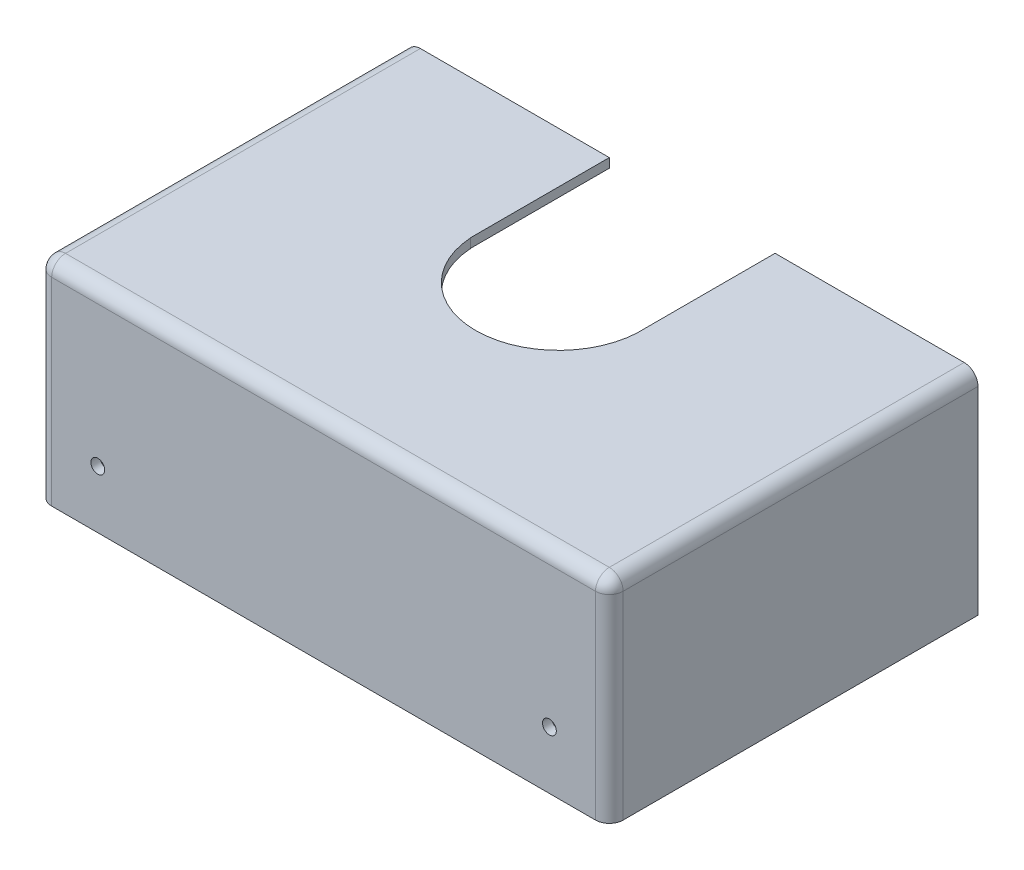
ISO-10303-21;
HEADER;
FILE_DESCRIPTION(('STEP AP214'),'2;1');
FILE_NAME('part.step','',(''),(''),'','','');
FILE_SCHEMA(('AUTOMOTIVE_DESIGN { 1 0 10303 214 1 1 1 1 }'));
ENDSEC;
DATA;
#1=APPLICATION_CONTEXT('core data for automotive mechanical design processes');
#2=APPLICATION_PROTOCOL_DEFINITION('international standard','automotive_design',2000,#1);
#3=PRODUCT_CONTEXT('',#1,'mechanical');
#4=PRODUCT('Part','Part','',(#3));
#5=PRODUCT_RELATED_PRODUCT_CATEGORY('part','',(#4));
#6=PRODUCT_DEFINITION_FORMATION('','',#4);
#7=PRODUCT_DEFINITION_CONTEXT('part definition',#1,'design');
#8=PRODUCT_DEFINITION('design','',#6,#7);
#9=PRODUCT_DEFINITION_SHAPE('','',#8);
#10=(LENGTH_UNIT() NAMED_UNIT(*) SI_UNIT(.MILLI.,.METRE.));
#11=(NAMED_UNIT(*) PLANE_ANGLE_UNIT() SI_UNIT($,.RADIAN.));
#12=(NAMED_UNIT(*) SI_UNIT($,.STERADIAN.) SOLID_ANGLE_UNIT());
#13=UNCERTAINTY_MEASURE_WITH_UNIT(LENGTH_MEASURE(1.E-05),#10,'distance_accuracy_value','');
#14=(GEOMETRIC_REPRESENTATION_CONTEXT(3) GLOBAL_UNCERTAINTY_ASSIGNED_CONTEXT((#13)) GLOBAL_UNIT_ASSIGNED_CONTEXT((#10,
#11,#12)) REPRESENTATION_CONTEXT('',''));
#15=CARTESIAN_POINT('',(0.,0.,0.));
#16=DIRECTION('',(0.,0.,1.));
#17=DIRECTION('',(1.,0.,0.));
#18=AXIS2_PLACEMENT_3D('',#15,#16,#17);
#19=CARTESIAN_POINT('',(0.,0.,0.));
#20=DIRECTION('',(0.,0.,-1.));
#21=DIRECTION('',(-1.,0.,0.));
#22=AXIS2_PLACEMENT_3D('',#19,#20,#21);
#23=PLANE('',#22);
#24=DIRECTION('',(-1.,0.,0.));
#25=VECTOR('',#24,1.);
#26=CARTESIAN_POINT('',(0.,46.,0.));
#27=LINE('',#26,#25);
#28=CARTESIAN_POINT('',(121.,46.,0.));
#29=VERTEX_POINT('',#28);
#30=CARTESIAN_POINT('',(79.964383320974,46.,0.));
#31=VERTEX_POINT('',#30);
#32=EDGE_CURVE('E184',#29,#31,#27,.T.);
#33=ORIENTED_EDGE('',*,*,#32,.F.);
#34=CARTESIAN_POINT('',(121.,43.,0.));
#35=DIRECTION('',(0.,0.,-1.));
#36=DIRECTION('',(-1.,0.,0.));
#37=AXIS2_PLACEMENT_3D('',#34,#35,#36);
#38=CIRCLE('',#37,3.);
#39=CARTESIAN_POINT('',(124.,43.,0.));
#40=VERTEX_POINT('',#39);
#41=EDGE_CURVE('E11',#29,#40,#38,.T.);
#42=ORIENTED_EDGE('',*,*,#41,.T.);
#43=DIRECTION('',(0.,1.,0.));
#44=VECTOR('',#43,1.);
#45=CARTESIAN_POINT('',(124.,0.,0.));
#46=LINE('',#45,#44);
#47=CARTESIAN_POINT('',(124.,0.,0.));
#48=VERTEX_POINT('',#47);
#49=EDGE_CURVE('E251',#48,#40,#46,.T.);
#50=ORIENTED_EDGE('',*,*,#49,.F.);
#51=DIRECTION('',(1.,0.,0.));
#52=VECTOR('',#51,1.);
#53=CARTESIAN_POINT('',(0.,0.,0.));
#54=LINE('',#53,#52);
#55=CARTESIAN_POINT('',(122.,0.,0.));
#56=VERTEX_POINT('',#55);
#57=EDGE_CURVE('E247',#56,#48,#54,.T.);
#58=ORIENTED_EDGE('',*,*,#57,.F.);
#59=DIRECTION('',(0.,-1.,0.));
#60=VECTOR('',#59,1.);
#61=CARTESIAN_POINT('',(122.,0.,0.));
#62=LINE('',#61,#60);
#63=CARTESIAN_POINT('',(122.,43.,0.));
#64=VERTEX_POINT('',#63);
#65=EDGE_CURVE('E232',#64,#56,#62,.T.);
#66=ORIENTED_EDGE('',*,*,#65,.F.);
#67=CARTESIAN_POINT('',(121.,43.,0.));
#68=DIRECTION('',(0.,0.,-1.));
#69=DIRECTION('',(-1.,0.,0.));
#70=AXIS2_PLACEMENT_3D('',#67,#68,#69);
#71=CIRCLE('',#70,1.);
#72=CARTESIAN_POINT('',(121.,44.,0.));
#73=VERTEX_POINT('',#72);
#74=EDGE_CURVE('E303',#64,#73,#71,.F.);
#75=ORIENTED_EDGE('',*,*,#74,.T.);
#76=DIRECTION('',(1.,0.,0.));
#77=VECTOR('',#76,1.);
#78=CARTESIAN_POINT('',(122.,44.,0.));
#79=LINE('',#78,#77);
#80=CARTESIAN_POINT('',(79.964383320974,44.,0.));
#81=VERTEX_POINT('',#80);
#82=EDGE_CURVE('E207',#81,#73,#79,.T.);
#83=ORIENTED_EDGE('',*,*,#82,.F.);
#84=DIRECTION('',(0.,1.,0.));
#85=VECTOR('',#84,1.);
#86=CARTESIAN_POINT('',(79.964383320974,-32.,0.));
#87=LINE('',#86,#85);
#88=EDGE_CURVE('E198',#81,#31,#87,.T.);
#89=ORIENTED_EDGE('',*,*,#88,.T.);
#90=EDGE_LOOP('',(#33,#42,#50,#58,#66,#75,#83,#89));
#91=FACE_BOUND('',#90,.T.);
#92=ADVANCED_FACE('F40',(#91),#23,.T.);
#93=CARTESIAN_POINT('',(0.,0.,80.));
#94=DIRECTION('',(1.,0.,0.));
#95=DIRECTION('',(0.,0.,-1.));
#96=AXIS2_PLACEMENT_3D('',#93,#94,#95);
#97=PLANE('',#96);
#98=DIRECTION('',(0.,0.,-1.));
#99=VECTOR('',#98,1.);
#100=CARTESIAN_POINT('',(0.,0.,80.));
#101=LINE('',#100,#99);
#102=CARTESIAN_POINT('',(0.,0.,77.));
#103=VERTEX_POINT('',#102);
#104=CARTESIAN_POINT('',(0.,0.,0.));
#105=VERTEX_POINT('',#104);
#106=EDGE_CURVE('E254',#103,#105,#101,.T.);
#107=ORIENTED_EDGE('',*,*,#106,.F.);
#108=DIRECTION('',(0.,-1.,0.));
#109=VECTOR('',#108,1.);
#110=CARTESIAN_POINT('',(0.,0.,77.));
#111=LINE('',#110,#109);
#112=CARTESIAN_POINT('',(0.,43.,77.));
#113=VERTEX_POINT('',#112);
#114=EDGE_CURVE('E322',#103,#113,#111,.F.);
#115=ORIENTED_EDGE('',*,*,#114,.T.);
#116=DIRECTION('',(0.,0.,-1.));
#117=VECTOR('',#116,1.);
#118=CARTESIAN_POINT('',(0.,43.,80.));
#119=LINE('',#118,#117);
#120=CARTESIAN_POINT('',(0.,43.,0.));
#121=VERTEX_POINT('',#120);
#122=EDGE_CURVE('E320',#113,#121,#119,.T.);
#123=ORIENTED_EDGE('',*,*,#122,.T.);
#124=DIRECTION('',(0.,-1.,0.));
#125=VECTOR('',#124,1.);
#126=CARTESIAN_POINT('',(0.,0.,0.));
#127=LINE('',#126,#125);
#128=EDGE_CURVE('E241',#121,#105,#127,.T.);
#129=ORIENTED_EDGE('',*,*,#128,.T.);
#130=EDGE_LOOP('',(#107,#115,#123,#129));
#131=FACE_BOUND('',#130,.T.);
#132=ADVANCED_FACE('F387',(#131),#97,.F.);
#133=CARTESIAN_POINT('',(0.,0.,80.));
#134=DIRECTION('',(0.,1.,0.));
#135=DIRECTION('',(0.,0.,1.));
#136=AXIS2_PLACEMENT_3D('',#133,#134,#135);
#137=PLANE('',#136);
#138=DIRECTION('',(1.,0.,0.));
#139=VECTOR('',#138,1.);
#140=CARTESIAN_POINT('',(0.,0.,80.));
#141=LINE('',#140,#139);
#142=CARTESIAN_POINT('',(3.,0.,80.));
#143=VERTEX_POINT('',#142);
#144=CARTESIAN_POINT('',(121.,0.,80.));
#145=VERTEX_POINT('',#144);
#146=EDGE_CURVE('E193',#143,#145,#141,.T.);
#147=ORIENTED_EDGE('',*,*,#146,.F.);
#148=CARTESIAN_POINT('',(3.,0.,77.));
#149=DIRECTION('',(0.,1.,0.));
#150=DIRECTION('',(0.,0.,1.));
#151=AXIS2_PLACEMENT_3D('',#148,#149,#150);
#152=CIRCLE('',#151,3.);
#153=EDGE_CURVE('E318',#143,#103,#152,.F.);
#154=ORIENTED_EDGE('',*,*,#153,.T.);
#155=ORIENTED_EDGE('',*,*,#106,.T.);
#156=CARTESIAN_POINT('',(2.,0.,0.));
#157=VERTEX_POINT('',#156);
#158=EDGE_CURVE('E248',#105,#157,#54,.T.);
#159=ORIENTED_EDGE('',*,*,#158,.T.);
#160=DIRECTION('',(0.,0.,-1.));
#161=VECTOR('',#160,1.);
#162=CARTESIAN_POINT('',(2.,0.,78.));
#163=LINE('',#162,#161);
#164=CARTESIAN_POINT('',(2.,0.,77.));
#165=VERTEX_POINT('',#164);
#166=EDGE_CURVE('E239',#165,#157,#163,.T.);
#167=ORIENTED_EDGE('',*,*,#166,.F.);
#168=CARTESIAN_POINT('',(3.,0.,77.));
#169=DIRECTION('',(0.,1.,0.));
#170=DIRECTION('',(0.,0.,1.));
#171=AXIS2_PLACEMENT_3D('',#168,#169,#170);
#172=CIRCLE('',#171,1.);
#173=CARTESIAN_POINT('',(3.,0.,78.));
#174=VERTEX_POINT('',#173);
#175=EDGE_CURVE('E277',#165,#174,#172,.T.);
#176=ORIENTED_EDGE('',*,*,#175,.T.);
#177=DIRECTION('',(-1.,0.,0.));
#178=VECTOR('',#177,1.);
#179=CARTESIAN_POINT('',(122.,0.,78.));
#180=LINE('',#179,#178);
#181=CARTESIAN_POINT('',(121.,0.,78.));
#182=VERTEX_POINT('',#181);
#183=EDGE_CURVE('E228',#182,#174,#180,.T.);
#184=ORIENTED_EDGE('',*,*,#183,.F.);
#185=CARTESIAN_POINT('',(121.,0.,77.));
#186=DIRECTION('',(0.,1.,0.));
#187=DIRECTION('',(0.,0.,1.));
#188=AXIS2_PLACEMENT_3D('',#185,#186,#187);
#189=CIRCLE('',#188,1.);
#190=CARTESIAN_POINT('',(122.,0.,77.));
#191=VERTEX_POINT('',#190);
#192=EDGE_CURVE('E301',#182,#191,#189,.T.);
#193=ORIENTED_EDGE('',*,*,#192,.T.);
#194=DIRECTION('',(0.,0.,-1.));
#195=VECTOR('',#194,1.);
#196=CARTESIAN_POINT('',(122.,0.,78.));
#197=LINE('',#196,#195);
#198=EDGE_CURVE('E230',#191,#56,#197,.T.);
#199=ORIENTED_EDGE('',*,*,#198,.T.);
#200=ORIENTED_EDGE('',*,*,#57,.T.);
#201=DIRECTION('',(0.,0.,-1.));
#202=VECTOR('',#201,1.);
#203=CARTESIAN_POINT('',(124.,0.,80.));
#204=LINE('',#203,#202);
#205=CARTESIAN_POINT('',(124.,0.,77.));
#206=VERTEX_POINT('',#205);
#207=EDGE_CURVE('E245',#206,#48,#204,.T.);
#208=ORIENTED_EDGE('',*,*,#207,.F.);
#209=CARTESIAN_POINT('',(121.,0.,77.));
#210=DIRECTION('',(0.,1.,0.));
#211=DIRECTION('',(0.,0.,1.));
#212=AXIS2_PLACEMENT_3D('',#209,#210,#211);
#213=CIRCLE('',#212,3.);
#214=EDGE_CURVE('E316',#206,#145,#213,.F.);
#215=ORIENTED_EDGE('',*,*,#214,.T.);
#216=EDGE_LOOP('',(#147,#154,#155,#159,#167,#176,#184,#193,#199,#200,#208,#215));
#217=FACE_BOUND('',#216,.T.);
#218=ADVANCED_FACE('F373',(#217),#137,.F.);
#219=CARTESIAN_POINT('',(124.,0.,80.));
#220=DIRECTION('',(-1.,0.,0.));
#221=DIRECTION('',(0.,0.,1.));
#222=AXIS2_PLACEMENT_3D('',#219,#220,#221);
#223=PLANE('',#222);
#224=DIRECTION('',(0.,0.,-1.));
#225=VECTOR('',#224,1.);
#226=CARTESIAN_POINT('',(124.,43.,80.));
#227=LINE('',#226,#225);
#228=CARTESIAN_POINT('',(124.,43.,77.));
#229=VERTEX_POINT('',#228);
#230=EDGE_CURVE('E57',#40,#229,#227,.F.);
#231=ORIENTED_EDGE('',*,*,#230,.T.);
#232=DIRECTION('',(0.,1.,0.));
#233=VECTOR('',#232,1.);
#234=CARTESIAN_POINT('',(124.,0.,77.));
#235=LINE('',#234,#233);
#236=EDGE_CURVE('E49',#229,#206,#235,.F.);
#237=ORIENTED_EDGE('',*,*,#236,.T.);
#238=ORIENTED_EDGE('',*,*,#207,.T.);
#239=ORIENTED_EDGE('',*,*,#49,.T.);
#240=EDGE_LOOP('',(#231,#237,#238,#239));
#241=FACE_BOUND('',#240,.T.);
#242=ADVANCED_FACE('F370',(#241),#223,.F.);
#243=CARTESIAN_POINT('',(0.,46.,80.));
#244=DIRECTION('',(0.,-1.,0.));
#245=DIRECTION('',(0.,0.,-1.));
#246=AXIS2_PLACEMENT_3D('',#243,#244,#245);
#247=PLANE('',#246);
#248=CARTESIAN_POINT('',(44.,46.,0.));
#249=VERTEX_POINT('',#248);
#250=CARTESIAN_POINT('',(3.,46.,0.));
#251=VERTEX_POINT('',#250);
#252=EDGE_CURVE('E194',#249,#251,#27,.T.);
#253=ORIENTED_EDGE('',*,*,#252,.T.);
#254=DIRECTION('',(0.,0.,-1.));
#255=VECTOR('',#254,1.);
#256=CARTESIAN_POINT('',(3.,46.,80.));
#257=LINE('',#256,#255);
#258=CARTESIAN_POINT('',(3.,46.,77.));
#259=VERTEX_POINT('',#258);
#260=EDGE_CURVE('E329',#251,#259,#257,.F.);
#261=ORIENTED_EDGE('',*,*,#260,.T.);
#262=DIRECTION('',(-1.,0.,0.));
#263=VECTOR('',#262,1.);
#264=CARTESIAN_POINT('',(0.,46.,77.));
#265=LINE('',#264,#263);
#266=CARTESIAN_POINT('',(121.,46.,77.));
#267=VERTEX_POINT('',#266);
#268=EDGE_CURVE('E327',#259,#267,#265,.F.);
#269=ORIENTED_EDGE('',*,*,#268,.T.);
#270=DIRECTION('',(0.,0.,-1.));
#271=VECTOR('',#270,1.);
#272=CARTESIAN_POINT('',(121.,46.,80.));
#273=LINE('',#272,#271);
#274=EDGE_CURVE('E191',#267,#29,#273,.T.);
#275=ORIENTED_EDGE('',*,*,#274,.T.);
#276=ORIENTED_EDGE('',*,*,#32,.T.);
#277=DIRECTION('',(0.,0.,-1.));
#278=VECTOR('',#277,1.);
#279=CARTESIAN_POINT('',(79.964383320974,46.,30.1317826191945));
#280=LINE('',#279,#278);
#281=CARTESIAN_POINT('',(79.964383320974,46.,27.8682173808054));
#282=VERTEX_POINT('',#281);
#283=EDGE_CURVE('E188',#282,#31,#280,.T.);
#284=ORIENTED_EDGE('',*,*,#283,.F.);
#285=CARTESIAN_POINT('',(62.,46.,29.));
#286=DIRECTION('',(0.,1.,0.));
#287=DIRECTION('',(0.,0.,1.));
#288=AXIS2_PLACEMENT_3D('',#285,#286,#287);
#289=CIRCLE('',#288,18.);
#290=CARTESIAN_POINT('',(44.035616679026,46.,30.1317826191945));
#291=VERTEX_POINT('',#290);
#292=EDGE_CURVE('E225',#291,#282,#289,.T.);
#293=ORIENTED_EDGE('',*,*,#292,.F.);
#294=DIRECTION('',(1.,0.,0.));
#295=VECTOR('',#294,1.);
#296=CARTESIAN_POINT('',(79.964383320974,46.,30.1317826191945));
#297=LINE('',#296,#295);
#298=CARTESIAN_POINT('',(44.,46.,30.1317826191945));
#299=VERTEX_POINT('',#298);
#300=EDGE_CURVE('E209',#299,#291,#297,.T.);
#301=ORIENTED_EDGE('',*,*,#300,.F.);
#302=DIRECTION('',(0.,0.,1.));
#303=VECTOR('',#302,1.);
#304=CARTESIAN_POINT('',(44.,46.,30.1317826191945));
#305=LINE('',#304,#303);
#306=EDGE_CURVE('E202',#249,#299,#305,.T.);
#307=ORIENTED_EDGE('',*,*,#306,.F.);
#308=EDGE_LOOP('',(#253,#261,#269,#275,#276,#284,#293,#301,#307));
#309=FACE_BOUND('',#308,.T.);
#310=ADVANCED_FACE('F187',(#309),#247,.F.);
#311=CARTESIAN_POINT('',(0.,0.,80.));
#312=DIRECTION('',(0.,0.,-1.));
#313=DIRECTION('',(-1.,0.,0.));
#314=AXIS2_PLACEMENT_3D('',#311,#312,#313);
#315=PLANE('',#314);
#316=CARTESIAN_POINT('',(13.,12.5,80.));
#317=DIRECTION('',(0.,0.,1.));
#318=DIRECTION('',(1.,0.,0.));
#319=AXIS2_PLACEMENT_3D('',#316,#317,#318);
#320=CIRCLE('',#319,1.5);
#321=CARTESIAN_POINT('',(14.5,12.5,80.));
#322=VERTEX_POINT('',#321);
#323=EDGE_CURVE('E781',#322,#322,#320,.T.);
#324=ORIENTED_EDGE('',*,*,#323,.F.);
#325=EDGE_LOOP('',(#324));
#326=FACE_BOUND('',#325,.T.);
#327=CARTESIAN_POINT('',(111.,12.5,80.));
#328=DIRECTION('',(0.,0.,1.));
#329=DIRECTION('',(1.,0.,0.));
#330=AXIS2_PLACEMENT_3D('',#327,#328,#329);
#331=CIRCLE('',#330,1.5);
#332=CARTESIAN_POINT('',(112.5,12.5,80.));
#333=VERTEX_POINT('',#332);
#334=EDGE_CURVE('E774',#333,#333,#331,.T.);
#335=ORIENTED_EDGE('',*,*,#334,.F.);
#336=EDGE_LOOP('',(#335));
#337=FACE_BOUND('',#336,.T.);
#338=DIRECTION('',(-1.,0.,0.));
#339=VECTOR('',#338,1.);
#340=CARTESIAN_POINT('',(0.,43.,80.));
#341=LINE('',#340,#339);
#342=CARTESIAN_POINT('',(121.,43.,80.));
#343=VERTEX_POINT('',#342);
#344=CARTESIAN_POINT('',(3.,43.,80.));
#345=VERTEX_POINT('',#344);
#346=EDGE_CURVE('E305',#343,#345,#341,.T.);
#347=ORIENTED_EDGE('',*,*,#346,.T.);
#348=DIRECTION('',(0.,-1.,0.));
#349=VECTOR('',#348,1.);
#350=CARTESIAN_POINT('',(3.,0.,80.));
#351=LINE('',#350,#349);
#352=EDGE_CURVE('E313',#345,#143,#351,.T.);
#353=ORIENTED_EDGE('',*,*,#352,.T.);
#354=ORIENTED_EDGE('',*,*,#146,.T.);
#355=DIRECTION('',(0.,1.,0.));
#356=VECTOR('',#355,1.);
#357=CARTESIAN_POINT('',(121.,0.,80.));
#358=LINE('',#357,#356);
#359=EDGE_CURVE('E311',#145,#343,#358,.T.);
#360=ORIENTED_EDGE('',*,*,#359,.T.);
#361=EDGE_LOOP('',(#347,#353,#354,#360));
#362=FACE_BOUND('',#361,.T.);
#363=ADVANCED_FACE('F362',(#326,#337,#362),#315,.F.);
#364=ORIENTED_EDGE('',*,*,#128,.F.);
#365=CARTESIAN_POINT('',(3.,43.,0.));
#366=DIRECTION('',(0.,0.,-1.));
#367=DIRECTION('',(-1.,0.,0.));
#368=AXIS2_PLACEMENT_3D('',#365,#366,#367);
#369=CIRCLE('',#368,3.);
#370=EDGE_CURVE('E324',#121,#251,#369,.T.);
#371=ORIENTED_EDGE('',*,*,#370,.T.);
#372=ORIENTED_EDGE('',*,*,#252,.F.);
#373=DIRECTION('',(0.,1.,0.));
#374=VECTOR('',#373,1.);
#375=CARTESIAN_POINT('',(44.,-32.,0.));
#376=LINE('',#375,#374);
#377=CARTESIAN_POINT('',(44.,44.,0.));
#378=VERTEX_POINT('',#377);
#379=EDGE_CURVE('E208',#378,#249,#376,.T.);
#380=ORIENTED_EDGE('',*,*,#379,.F.);
#381=CARTESIAN_POINT('',(3.,44.,0.));
#382=VERTEX_POINT('',#381);
#383=EDGE_CURVE('E231',#382,#378,#79,.T.);
#384=ORIENTED_EDGE('',*,*,#383,.F.);
#385=CARTESIAN_POINT('',(3.,43.,0.));
#386=DIRECTION('',(0.,0.,-1.));
#387=DIRECTION('',(-1.,0.,0.));
#388=AXIS2_PLACEMENT_3D('',#385,#386,#387);
#389=CIRCLE('',#388,1.);
#390=CARTESIAN_POINT('',(2.,43.,0.));
#391=VERTEX_POINT('',#390);
#392=EDGE_CURVE('E280',#382,#391,#389,.F.);
#393=ORIENTED_EDGE('',*,*,#392,.T.);
#394=DIRECTION('',(0.,1.,0.));
#395=VECTOR('',#394,1.);
#396=CARTESIAN_POINT('',(2.,0.,0.));
#397=LINE('',#396,#395);
#398=EDGE_CURVE('E235',#157,#391,#397,.T.);
#399=ORIENTED_EDGE('',*,*,#398,.F.);
#400=ORIENTED_EDGE('',*,*,#158,.F.);
#401=EDGE_LOOP('',(#364,#371,#372,#380,#384,#393,#399,#400));
#402=FACE_BOUND('',#401,.T.);
#403=ADVANCED_FACE('F389',(#402),#23,.T.);
#404=CARTESIAN_POINT('',(122.,0.,78.));
#405=DIRECTION('',(1.,0.,0.));
#406=DIRECTION('',(0.,0.,-1.));
#407=AXIS2_PLACEMENT_3D('',#404,#405,#406);
#408=PLANE('',#407);
#409=ORIENTED_EDGE('',*,*,#198,.F.);
#410=DIRECTION('',(0.,-1.,0.));
#411=VECTOR('',#410,1.);
#412=CARTESIAN_POINT('',(122.,43.,77.));
#413=LINE('',#412,#411);
#414=CARTESIAN_POINT('',(122.,43.,77.));
#415=VERTEX_POINT('',#414);
#416=EDGE_CURVE('E297',#191,#415,#413,.F.);
#417=ORIENTED_EDGE('',*,*,#416,.T.);
#418=DIRECTION('',(0.,0.,-1.));
#419=VECTOR('',#418,1.);
#420=CARTESIAN_POINT('',(122.,43.,0.));
#421=LINE('',#420,#419);
#422=EDGE_CURVE('E295',#415,#64,#421,.T.);
#423=ORIENTED_EDGE('',*,*,#422,.T.);
#424=ORIENTED_EDGE('',*,*,#65,.T.);
#425=EDGE_LOOP('',(#409,#417,#423,#424));
#426=FACE_BOUND('',#425,.T.);
#427=ADVANCED_FACE('F398',(#426),#408,.F.);
#428=CARTESIAN_POINT('',(122.,44.,78.));
#429=DIRECTION('',(0.,1.,0.));
#430=DIRECTION('',(0.,0.,1.));
#431=AXIS2_PLACEMENT_3D('',#428,#429,#430);
#432=PLANE('',#431);
#433=ORIENTED_EDGE('',*,*,#82,.T.);
#434=DIRECTION('',(0.,0.,-1.));
#435=VECTOR('',#434,1.);
#436=CARTESIAN_POINT('',(121.,44.,77.));
#437=LINE('',#436,#435);
#438=CARTESIAN_POINT('',(121.,44.,77.));
#439=VERTEX_POINT('',#438);
#440=EDGE_CURVE('E299',#73,#439,#437,.F.);
#441=ORIENTED_EDGE('',*,*,#440,.T.);
#442=DIRECTION('',(1.,0.,0.));
#443=VECTOR('',#442,1.);
#444=CARTESIAN_POINT('',(2.,44.,77.));
#445=LINE('',#444,#443);
#446=CARTESIAN_POINT('',(3.,44.,77.));
#447=VERTEX_POINT('',#446);
#448=EDGE_CURVE('E273',#439,#447,#445,.F.);
#449=ORIENTED_EDGE('',*,*,#448,.T.);
#450=DIRECTION('',(0.,0.,-1.));
#451=VECTOR('',#450,1.);
#452=CARTESIAN_POINT('',(3.,44.,0.));
#453=LINE('',#452,#451);
#454=EDGE_CURVE('E275',#447,#382,#453,.T.);
#455=ORIENTED_EDGE('',*,*,#454,.T.);
#456=ORIENTED_EDGE('',*,*,#383,.T.);
#457=DIRECTION('',(0.,0.,1.));
#458=VECTOR('',#457,1.);
#459=CARTESIAN_POINT('',(44.,44.,78.));
#460=LINE('',#459,#458);
#461=CARTESIAN_POINT('',(44.,44.,30.1317826191945));
#462=VERTEX_POINT('',#461);
#463=EDGE_CURVE('E218',#378,#462,#460,.T.);
#464=ORIENTED_EDGE('',*,*,#463,.T.);
#465=DIRECTION('',(1.,0.,0.));
#466=VECTOR('',#465,1.);
#467=CARTESIAN_POINT('',(122.,44.,30.1317826191945));
#468=LINE('',#467,#466);
#469=CARTESIAN_POINT('',(44.035616679026,44.,30.1317826191945));
#470=VERTEX_POINT('',#469);
#471=EDGE_CURVE('E220',#462,#470,#468,.T.);
#472=ORIENTED_EDGE('',*,*,#471,.T.);
#473=CARTESIAN_POINT('',(62.,44.,29.));
#474=DIRECTION('',(0.,1.,0.));
#475=DIRECTION('',(0.,0.,1.));
#476=AXIS2_PLACEMENT_3D('',#473,#474,#475);
#477=CIRCLE('',#476,18.);
#478=CARTESIAN_POINT('',(79.964383320974,44.,27.8682173808054));
#479=VERTEX_POINT('',#478);
#480=EDGE_CURVE('E227',#470,#479,#477,.T.);
#481=ORIENTED_EDGE('',*,*,#480,.T.);
#482=DIRECTION('',(0.,0.,-1.));
#483=VECTOR('',#482,1.);
#484=CARTESIAN_POINT('',(79.964383320974,44.,78.));
#485=LINE('',#484,#483);
#486=EDGE_CURVE('E223',#479,#81,#485,.T.);
#487=ORIENTED_EDGE('',*,*,#486,.T.);
#488=EDGE_LOOP('',(#433,#441,#449,#455,#456,#464,#472,#481,#487));
#489=FACE_BOUND('',#488,.T.);
#490=ADVANCED_FACE('F404',(#489),#432,.F.);
#491=CARTESIAN_POINT('',(2.,0.,78.));
#492=DIRECTION('',(-1.,0.,0.));
#493=DIRECTION('',(0.,0.,1.));
#494=AXIS2_PLACEMENT_3D('',#491,#492,#493);
#495=PLANE('',#494);
#496=DIRECTION('',(0.,0.,-1.));
#497=VECTOR('',#496,1.);
#498=CARTESIAN_POINT('',(2.,43.,78.));
#499=LINE('',#498,#497);
#500=CARTESIAN_POINT('',(2.,43.,77.));
#501=VERTEX_POINT('',#500);
#502=EDGE_CURVE('E269',#391,#501,#499,.F.);
#503=ORIENTED_EDGE('',*,*,#502,.T.);
#504=DIRECTION('',(0.,1.,0.));
#505=VECTOR('',#504,1.);
#506=CARTESIAN_POINT('',(2.,0.,77.));
#507=LINE('',#506,#505);
#508=EDGE_CURVE('E271',#501,#165,#507,.F.);
#509=ORIENTED_EDGE('',*,*,#508,.T.);
#510=ORIENTED_EDGE('',*,*,#166,.T.);
#511=ORIENTED_EDGE('',*,*,#398,.T.);
#512=EDGE_LOOP('',(#503,#509,#510,#511));
#513=FACE_BOUND('',#512,.T.);
#514=ADVANCED_FACE('F464',(#513),#495,.F.);
#515=CARTESIAN_POINT('',(0.,0.,78.));
#516=DIRECTION('',(0.,0.,1.));
#517=DIRECTION('',(1.,0.,0.));
#518=AXIS2_PLACEMENT_3D('',#515,#516,#517);
#519=PLANE('',#518);
#520=CARTESIAN_POINT('',(13.,12.5,78.));
#521=DIRECTION('',(0.,0.,1.));
#522=DIRECTION('',(1.,0.,0.));
#523=AXIS2_PLACEMENT_3D('',#520,#521,#522);
#524=CIRCLE('',#523,1.49999999999999);
#525=CARTESIAN_POINT('',(14.5,12.5,78.));
#526=VERTEX_POINT('',#525);
#527=EDGE_CURVE('E770',#526,#526,#524,.T.);
#528=ORIENTED_EDGE('',*,*,#527,.T.);
#529=EDGE_LOOP('',(#528));
#530=FACE_BOUND('',#529,.T.);
#531=CARTESIAN_POINT('',(111.,12.5,78.));
#532=DIRECTION('',(0.,0.,1.));
#533=DIRECTION('',(1.,0.,0.));
#534=AXIS2_PLACEMENT_3D('',#531,#532,#533);
#535=CIRCLE('',#534,1.49999999999999);
#536=CARTESIAN_POINT('',(112.5,12.5,78.));
#537=VERTEX_POINT('',#536);
#538=EDGE_CURVE('E337',#537,#537,#535,.T.);
#539=ORIENTED_EDGE('',*,*,#538,.T.);
#540=EDGE_LOOP('',(#539));
#541=FACE_BOUND('',#540,.T.);
#542=DIRECTION('',(1.,0.,0.));
#543=VECTOR('',#542,1.);
#544=CARTESIAN_POINT('',(122.,43.,78.));
#545=LINE('',#544,#543);
#546=CARTESIAN_POINT('',(3.,43.,78.));
#547=VERTEX_POINT('',#546);
#548=CARTESIAN_POINT('',(121.,43.,78.));
#549=VERTEX_POINT('',#548);
#550=EDGE_CURVE('E263',#547,#549,#545,.T.);
#551=ORIENTED_EDGE('',*,*,#550,.T.);
#552=DIRECTION('',(0.,-1.,0.));
#553=VECTOR('',#552,1.);
#554=CARTESIAN_POINT('',(121.,0.,78.));
#555=LINE('',#554,#553);
#556=EDGE_CURVE('E293',#549,#182,#555,.T.);
#557=ORIENTED_EDGE('',*,*,#556,.T.);
#558=ORIENTED_EDGE('',*,*,#183,.T.);
#559=DIRECTION('',(0.,1.,0.));
#560=VECTOR('',#559,1.);
#561=CARTESIAN_POINT('',(3.,44.,78.));
#562=LINE('',#561,#560);
#563=EDGE_CURVE('E266',#174,#547,#562,.T.);
#564=ORIENTED_EDGE('',*,*,#563,.T.);
#565=EDGE_LOOP('',(#551,#557,#558,#564));
#566=FACE_BOUND('',#565,.T.);
#567=ADVANCED_FACE('F448',(#530,#541,#566),#519,.F.);
#568=CARTESIAN_POINT('',(62.,-32.,29.));
#569=DIRECTION('',(0.,1.,0.));
#570=DIRECTION('',(0.,0.,1.));
#571=AXIS2_PLACEMENT_3D('',#568,#569,#570);
#572=CYLINDRICAL_SURFACE('',#571,18.);
#573=DIRECTION('',(0.,1.,0.));
#574=VECTOR('',#573,1.);
#575=CARTESIAN_POINT('',(44.035616679026,-32.,30.1317826191945));
#576=LINE('',#575,#574);
#577=EDGE_CURVE('E257',#470,#291,#576,.T.);
#578=ORIENTED_EDGE('',*,*,#577,.T.);
#579=ORIENTED_EDGE('',*,*,#292,.T.);
#580=DIRECTION('',(0.,1.,0.));
#581=VECTOR('',#580,1.);
#582=CARTESIAN_POINT('',(79.964383320974,-32.,27.8682173808054));
#583=LINE('',#582,#581);
#584=EDGE_CURVE('E201',#282,#479,#583,.F.);
#585=ORIENTED_EDGE('',*,*,#584,.T.);
#586=ORIENTED_EDGE('',*,*,#480,.F.);
#587=EDGE_LOOP('',(#578,#579,#585,#586));
#588=FACE_BOUND('',#587,.T.);
#589=ADVANCED_FACE('F433',(#588),#572,.F.);
#590=CARTESIAN_POINT('',(79.964383320974,-32.,30.1317826191945));
#591=DIRECTION('',(0.,0.,1.));
#592=DIRECTION('',(1.,0.,0.));
#593=AXIS2_PLACEMENT_3D('',#590,#591,#592);
#594=PLANE('',#593);
#595=DIRECTION('',(0.,1.,0.));
#596=VECTOR('',#595,1.);
#597=CARTESIAN_POINT('',(44.,-32.,30.1317826191945));
#598=LINE('',#597,#596);
#599=EDGE_CURVE('E212',#462,#299,#598,.T.);
#600=ORIENTED_EDGE('',*,*,#599,.T.);
#601=ORIENTED_EDGE('',*,*,#300,.T.);
#602=ORIENTED_EDGE('',*,*,#577,.F.);
#603=ORIENTED_EDGE('',*,*,#471,.F.);
#604=EDGE_LOOP('',(#600,#601,#602,#603));
#605=FACE_BOUND('',#604,.T.);
#606=ADVANCED_FACE('F431',(#605),#594,.F.);
#607=CARTESIAN_POINT('',(44.,-32.,30.1317826191945));
#608=DIRECTION('',(-1.,0.,0.));
#609=DIRECTION('',(0.,0.,1.));
#610=AXIS2_PLACEMENT_3D('',#607,#608,#609);
#611=PLANE('',#610);
#612=ORIENTED_EDGE('',*,*,#379,.T.);
#613=ORIENTED_EDGE('',*,*,#306,.T.);
#614=ORIENTED_EDGE('',*,*,#599,.F.);
#615=ORIENTED_EDGE('',*,*,#463,.F.);
#616=EDGE_LOOP('',(#612,#613,#614,#615));
#617=FACE_BOUND('',#616,.T.);
#618=ADVANCED_FACE('F425',(#617),#611,.F.);
#619=CARTESIAN_POINT('',(79.964383320974,-32.,30.1317826191945));
#620=DIRECTION('',(1.,0.,0.));
#621=DIRECTION('',(0.,0.,-1.));
#622=AXIS2_PLACEMENT_3D('',#619,#620,#621);
#623=PLANE('',#622);
#624=ORIENTED_EDGE('',*,*,#584,.F.);
#625=ORIENTED_EDGE('',*,*,#283,.T.);
#626=ORIENTED_EDGE('',*,*,#88,.F.);
#627=ORIENTED_EDGE('',*,*,#486,.F.);
#628=EDGE_LOOP('',(#624,#625,#626,#627));
#629=FACE_BOUND('',#628,.T.);
#630=ADVANCED_FACE('F197',(#629),#623,.F.);
#631=CARTESIAN_POINT('',(0.,43.,77.));
#632=DIRECTION('',(-1.,0.,0.));
#633=DIRECTION('',(0.,0.,1.));
#634=AXIS2_PLACEMENT_3D('',#631,#632,#633);
#635=CYLINDRICAL_SURFACE('',#634,1.);
#636=ORIENTED_EDGE('',*,*,#448,.F.);
#637=CARTESIAN_POINT('',(121.,43.,77.));
#638=DIRECTION('',(-1.,0.,0.));
#639=DIRECTION('',(0.,0.,1.));
#640=AXIS2_PLACEMENT_3D('',#637,#638,#639);
#641=CIRCLE('',#640,1.);
#642=EDGE_CURVE('E282',#439,#549,#641,.F.);
#643=ORIENTED_EDGE('',*,*,#642,.T.);
#644=ORIENTED_EDGE('',*,*,#550,.F.);
#645=CARTESIAN_POINT('',(3.,43.,77.));
#646=DIRECTION('',(1.,0.,0.));
#647=DIRECTION('',(0.,0.,-1.));
#648=AXIS2_PLACEMENT_3D('',#645,#646,#647);
#649=CIRCLE('',#648,1.);
#650=EDGE_CURVE('E203',#447,#547,#649,.T.);
#651=ORIENTED_EDGE('',*,*,#650,.F.);
#652=EDGE_LOOP('',(#636,#643,#644,#651));
#653=FACE_BOUND('',#652,.T.);
#654=ADVANCED_FACE('F445',(#653),#635,.F.);
#655=CARTESIAN_POINT('',(3.,43.,78.));
#656=DIRECTION('',(0.,0.,1.));
#657=DIRECTION('',(1.,0.,0.));
#658=AXIS2_PLACEMENT_3D('',#655,#656,#657);
#659=CYLINDRICAL_SURFACE('',#658,1.);
#660=ORIENTED_EDGE('',*,*,#392,.F.);
#661=ORIENTED_EDGE('',*,*,#454,.F.);
#662=CARTESIAN_POINT('',(3.,43.,77.));
#663=DIRECTION('',(0.,0.,-1.));
#664=DIRECTION('',(-1.,0.,0.));
#665=AXIS2_PLACEMENT_3D('',#662,#663,#664);
#666=CIRCLE('',#665,1.);
#667=EDGE_CURVE('E285',#501,#447,#666,.T.);
#668=ORIENTED_EDGE('',*,*,#667,.F.);
#669=ORIENTED_EDGE('',*,*,#502,.F.);
#670=EDGE_LOOP('',(#660,#661,#668,#669));
#671=FACE_BOUND('',#670,.T.);
#672=ADVANCED_FACE('F462',(#671),#659,.F.);
#673=CARTESIAN_POINT('',(3.,43.,77.));
#674=DIRECTION('',(0.,0.,1.));
#675=DIRECTION('',(1.,0.,0.));
#676=AXIS2_PLACEMENT_3D('',#673,#674,#675);
#677=SPHERICAL_SURFACE('',#676,1.);
#678=ORIENTED_EDGE('',*,*,#667,.T.);
#679=ORIENTED_EDGE('',*,*,#650,.T.);
#680=CARTESIAN_POINT('',(3.,43.,77.));
#681=DIRECTION('',(0.,-1.,0.));
#682=DIRECTION('',(0.,0.,-1.));
#683=AXIS2_PLACEMENT_3D('',#680,#681,#682);
#684=CIRCLE('',#683,1.);
#685=EDGE_CURVE('E283',#501,#547,#684,.F.);
#686=ORIENTED_EDGE('',*,*,#685,.F.);
#687=EDGE_LOOP('',(#678,#679,#686));
#688=FACE_BOUND('',#687,.T.);
#689=ADVANCED_FACE('F457',(#688),#677,.F.);
#690=CARTESIAN_POINT('',(3.,0.,77.));
#691=DIRECTION('',(0.,-1.,0.));
#692=DIRECTION('',(0.,0.,-1.));
#693=AXIS2_PLACEMENT_3D('',#690,#691,#692);
#694=CYLINDRICAL_SURFACE('',#693,1.);
#695=ORIENTED_EDGE('',*,*,#175,.F.);
#696=ORIENTED_EDGE('',*,*,#508,.F.);
#697=ORIENTED_EDGE('',*,*,#685,.T.);
#698=ORIENTED_EDGE('',*,*,#563,.F.);
#699=EDGE_LOOP('',(#695,#696,#697,#698));
#700=FACE_BOUND('',#699,.T.);
#701=ADVANCED_FACE('F453',(#700),#694,.F.);
#702=CARTESIAN_POINT('',(121.,0.,77.));
#703=DIRECTION('',(0.,1.,0.));
#704=DIRECTION('',(0.,0.,1.));
#705=AXIS2_PLACEMENT_3D('',#702,#703,#704);
#706=CYLINDRICAL_SURFACE('',#705,1.);
#707=ORIENTED_EDGE('',*,*,#192,.F.);
#708=ORIENTED_EDGE('',*,*,#556,.F.);
#709=CARTESIAN_POINT('',(121.,43.,77.));
#710=DIRECTION('',(0.,-1.,0.));
#711=DIRECTION('',(0.,0.,-1.));
#712=AXIS2_PLACEMENT_3D('',#709,#710,#711);
#713=CIRCLE('',#712,1.);
#714=EDGE_CURVE('E286',#415,#549,#713,.T.);
#715=ORIENTED_EDGE('',*,*,#714,.F.);
#716=ORIENTED_EDGE('',*,*,#416,.F.);
#717=EDGE_LOOP('',(#707,#708,#715,#716));
#718=FACE_BOUND('',#717,.T.);
#719=ADVANCED_FACE('F576',(#718),#706,.F.);
#720=CARTESIAN_POINT('',(121.,43.,78.));
#721=DIRECTION('',(0.,0.,1.));
#722=DIRECTION('',(1.,0.,0.));
#723=AXIS2_PLACEMENT_3D('',#720,#721,#722);
#724=CYLINDRICAL_SURFACE('',#723,1.);
#725=ORIENTED_EDGE('',*,*,#74,.F.);
#726=ORIENTED_EDGE('',*,*,#422,.F.);
#727=CARTESIAN_POINT('',(121.,43.,77.));
#728=DIRECTION('',(0.,0.,-1.));
#729=DIRECTION('',(-1.,0.,0.));
#730=AXIS2_PLACEMENT_3D('',#727,#728,#729);
#731=CIRCLE('',#730,1.);
#732=EDGE_CURVE('E306',#439,#415,#731,.T.);
#733=ORIENTED_EDGE('',*,*,#732,.F.);
#734=ORIENTED_EDGE('',*,*,#440,.F.);
#735=EDGE_LOOP('',(#725,#726,#733,#734));
#736=FACE_BOUND('',#735,.T.);
#737=ADVANCED_FACE('F383',(#736),#724,.F.);
#738=CARTESIAN_POINT('',(121.,43.,77.));
#739=DIRECTION('',(1.,0.,0.));
#740=DIRECTION('',(0.,0.,-1.));
#741=AXIS2_PLACEMENT_3D('',#738,#739,#740);
#742=SPHERICAL_SURFACE('',#741,1.);
#743=ORIENTED_EDGE('',*,*,#714,.T.);
#744=ORIENTED_EDGE('',*,*,#642,.F.);
#745=ORIENTED_EDGE('',*,*,#732,.T.);
#746=EDGE_LOOP('',(#743,#744,#745));
#747=FACE_BOUND('',#746,.T.);
#748=ADVANCED_FACE('F378',(#747),#742,.F.);
#749=CARTESIAN_POINT('',(121.,43.,80.));
#750=DIRECTION('',(0.,0.,-1.));
#751=DIRECTION('',(-1.,0.,0.));
#752=AXIS2_PLACEMENT_3D('',#749,#750,#751);
#753=CYLINDRICAL_SURFACE('',#752,3.);
#754=ORIENTED_EDGE('',*,*,#41,.F.);
#755=ORIENTED_EDGE('',*,*,#274,.F.);
#756=CARTESIAN_POINT('',(121.,43.,77.));
#757=DIRECTION('',(0.,0.,1.));
#758=DIRECTION('',(1.,0.,0.));
#759=AXIS2_PLACEMENT_3D('',#756,#757,#758);
#760=CIRCLE('',#759,3.);
#761=EDGE_CURVE('E44',#229,#267,#760,.T.);
#762=ORIENTED_EDGE('',*,*,#761,.F.);
#763=ORIENTED_EDGE('',*,*,#230,.F.);
#764=EDGE_LOOP('',(#754,#755,#762,#763));
#765=FACE_BOUND('',#764,.T.);
#766=ADVANCED_FACE('F42',(#765),#753,.T.);
#767=CARTESIAN_POINT('',(121.,0.,77.));
#768=DIRECTION('',(0.,1.,0.));
#769=DIRECTION('',(0.,0.,1.));
#770=AXIS2_PLACEMENT_3D('',#767,#768,#769);
#771=CYLINDRICAL_SURFACE('',#770,3.);
#772=ORIENTED_EDGE('',*,*,#214,.F.);
#773=ORIENTED_EDGE('',*,*,#236,.F.);
#774=CARTESIAN_POINT('',(121.,43.,77.));
#775=DIRECTION('',(0.,1.,0.));
#776=DIRECTION('',(0.,0.,1.));
#777=AXIS2_PLACEMENT_3D('',#774,#775,#776);
#778=CIRCLE('',#777,3.);
#779=EDGE_CURVE('E345',#343,#229,#778,.T.);
#780=ORIENTED_EDGE('',*,*,#779,.F.);
#781=ORIENTED_EDGE('',*,*,#359,.F.);
#782=EDGE_LOOP('',(#772,#773,#780,#781));
#783=FACE_BOUND('',#782,.T.);
#784=ADVANCED_FACE('F368',(#783),#771,.T.);
#785=CARTESIAN_POINT('',(121.,43.,77.));
#786=DIRECTION('',(0.,0.,1.));
#787=DIRECTION('',(1.,0.,0.));
#788=AXIS2_PLACEMENT_3D('',#785,#786,#787);
#789=SPHERICAL_SURFACE('',#788,3.);
#790=ORIENTED_EDGE('',*,*,#779,.T.);
#791=ORIENTED_EDGE('',*,*,#761,.T.);
#792=CARTESIAN_POINT('',(121.,43.,77.));
#793=DIRECTION('',(1.,0.,0.));
#794=DIRECTION('',(0.,0.,-1.));
#795=AXIS2_PLACEMENT_3D('',#792,#793,#794);
#796=CIRCLE('',#795,3.);
#797=EDGE_CURVE('E343',#343,#267,#796,.F.);
#798=ORIENTED_EDGE('',*,*,#797,.F.);
#799=EDGE_LOOP('',(#790,#791,#798));
#800=FACE_BOUND('',#799,.T.);
#801=ADVANCED_FACE('F352',(#800),#789,.T.);
#802=CARTESIAN_POINT('',(3.,43.,80.));
#803=DIRECTION('',(0.,0.,-1.));
#804=DIRECTION('',(-1.,0.,0.));
#805=AXIS2_PLACEMENT_3D('',#802,#803,#804);
#806=CYLINDRICAL_SURFACE('',#805,3.);
#807=ORIENTED_EDGE('',*,*,#370,.F.);
#808=ORIENTED_EDGE('',*,*,#122,.F.);
#809=CARTESIAN_POINT('',(3.,43.,77.));
#810=DIRECTION('',(0.,0.,1.));
#811=DIRECTION('',(1.,0.,0.));
#812=AXIS2_PLACEMENT_3D('',#809,#810,#811);
#813=CIRCLE('',#812,3.);
#814=EDGE_CURVE('E340',#259,#113,#813,.T.);
#815=ORIENTED_EDGE('',*,*,#814,.F.);
#816=ORIENTED_EDGE('',*,*,#260,.F.);
#817=EDGE_LOOP('',(#807,#808,#815,#816));
#818=FACE_BOUND('',#817,.T.);
#819=ADVANCED_FACE('F417',(#818),#806,.T.);
#820=CARTESIAN_POINT('',(0.,43.,77.));
#821=DIRECTION('',(-1.,0.,0.));
#822=DIRECTION('',(0.,0.,1.));
#823=AXIS2_PLACEMENT_3D('',#820,#821,#822);
#824=CYLINDRICAL_SURFACE('',#823,3.);
#825=ORIENTED_EDGE('',*,*,#797,.T.);
#826=ORIENTED_EDGE('',*,*,#268,.F.);
#827=CARTESIAN_POINT('',(3.,43.,77.));
#828=DIRECTION('',(-1.,0.,0.));
#829=DIRECTION('',(0.,0.,1.));
#830=AXIS2_PLACEMENT_3D('',#827,#828,#829);
#831=CIRCLE('',#830,3.);
#832=EDGE_CURVE('E336',#345,#259,#831,.T.);
#833=ORIENTED_EDGE('',*,*,#832,.F.);
#834=ORIENTED_EDGE('',*,*,#346,.F.);
#835=EDGE_LOOP('',(#825,#826,#833,#834));
#836=FACE_BOUND('',#835,.T.);
#837=ADVANCED_FACE('F357',(#836),#824,.T.);
#838=CARTESIAN_POINT('',(3.,43.,77.));
#839=DIRECTION('',(0.,0.,1.));
#840=DIRECTION('',(1.,0.,0.));
#841=AXIS2_PLACEMENT_3D('',#838,#839,#840);
#842=SPHERICAL_SURFACE('',#841,3.);
#843=ORIENTED_EDGE('',*,*,#832,.T.);
#844=ORIENTED_EDGE('',*,*,#814,.T.);
#845=CARTESIAN_POINT('',(3.,43.,77.));
#846=DIRECTION('',(0.,1.,0.));
#847=DIRECTION('',(0.,0.,1.));
#848=AXIS2_PLACEMENT_3D('',#845,#846,#847);
#849=CIRCLE('',#848,3.);
#850=EDGE_CURVE('E333',#345,#113,#849,.F.);
#851=ORIENTED_EDGE('',*,*,#850,.F.);
#852=EDGE_LOOP('',(#843,#844,#851));
#853=FACE_BOUND('',#852,.T.);
#854=ADVANCED_FACE('F470',(#853),#842,.T.);
#855=CARTESIAN_POINT('',(3.,0.,77.));
#856=DIRECTION('',(0.,-1.,0.));
#857=DIRECTION('',(0.,0.,-1.));
#858=AXIS2_PLACEMENT_3D('',#855,#856,#857);
#859=CYLINDRICAL_SURFACE('',#858,3.);
#860=ORIENTED_EDGE('',*,*,#850,.T.);
#861=ORIENTED_EDGE('',*,*,#114,.F.);
#862=ORIENTED_EDGE('',*,*,#153,.F.);
#863=ORIENTED_EDGE('',*,*,#352,.F.);
#864=EDGE_LOOP('',(#860,#861,#862,#863));
#865=FACE_BOUND('',#864,.T.);
#866=ADVANCED_FACE('F468',(#865),#859,.T.);
#867=CARTESIAN_POINT('',(111.,12.5,80.));
#868=DIRECTION('',(0.,0.,1.));
#869=DIRECTION('',(1.,0.,0.));
#870=AXIS2_PLACEMENT_3D('',#867,#868,#869);
#871=CYLINDRICAL_SURFACE('',#870,1.49999999999999);
#872=ORIENTED_EDGE('',*,*,#334,.T.);
#873=EDGE_LOOP('',(#872));
#874=FACE_BOUND('',#873,.T.);
#875=ORIENTED_EDGE('',*,*,#538,.F.);
#876=EDGE_LOOP('',(#875));
#877=FACE_BOUND('',#876,.T.);
#878=ADVANCED_FACE('F477',(#874,#877),#871,.F.);
#879=CARTESIAN_POINT('',(13.,12.5,80.));
#880=DIRECTION('',(0.,0.,1.));
#881=DIRECTION('',(1.,0.,0.));
#882=AXIS2_PLACEMENT_3D('',#879,#880,#881);
#883=CYLINDRICAL_SURFACE('',#882,1.49999999999999);
#884=ORIENTED_EDGE('',*,*,#323,.T.);
#885=EDGE_LOOP('',(#884));
#886=FACE_BOUND('',#885,.T.);
#887=ORIENTED_EDGE('',*,*,#527,.F.);
#888=EDGE_LOOP('',(#887));
#889=FACE_BOUND('',#888,.T.);
#890=ADVANCED_FACE('F517',(#886,#889),#883,.F.);
#891=CLOSED_SHELL('',(#92,#132,#218,#242,#310,#363,#403,#427,#490,#514,#567,#589,#606,#618,#630,
#654,#672,#689,#701,#719,#737,#748,#766,#784,#801,#819,#837,#854,#866,#878,#890));
#892=MANIFOLD_SOLID_BREP('B2',#891);
#893=ADVANCED_BREP_SHAPE_REPRESENTATION('',(#18,#892),#14);
#894=SHAPE_DEFINITION_REPRESENTATION(#9,#893);
ENDSEC;
END-ISO-10303-21;
